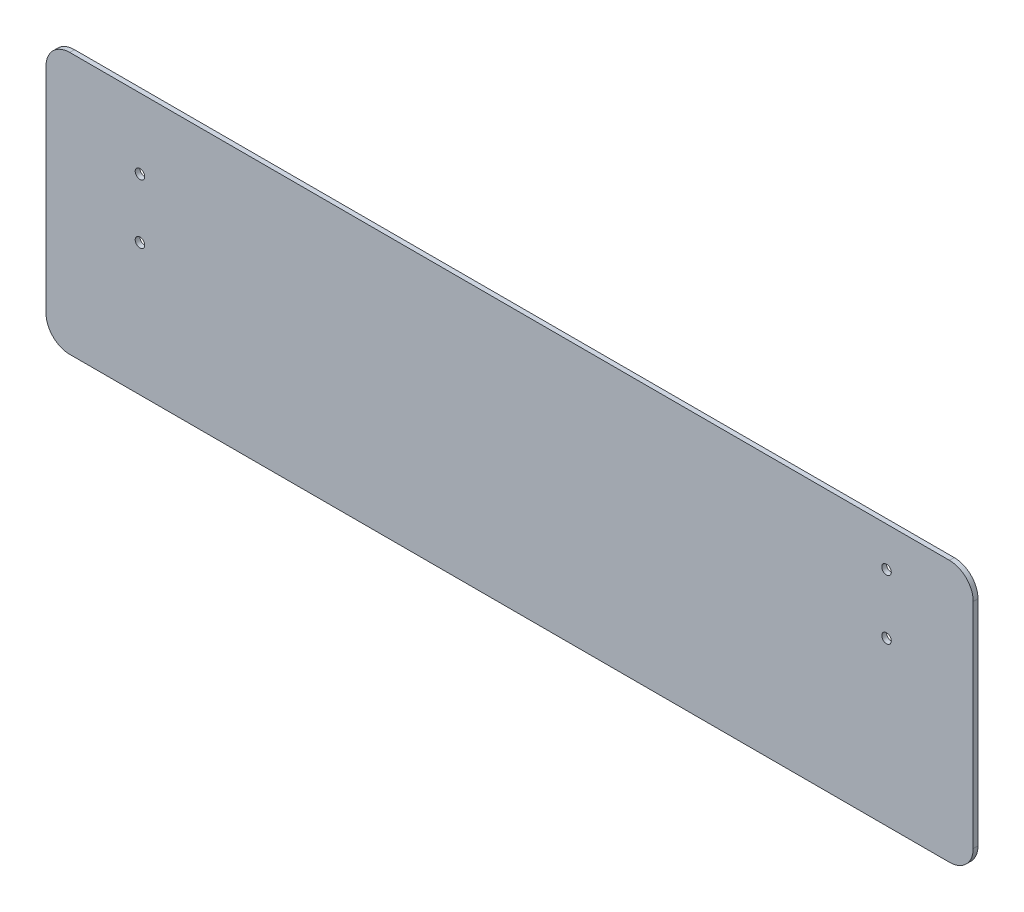
ISO-10303-21;
HEADER;
FILE_DESCRIPTION(('STEP AP214'),'2;1');
FILE_NAME('part.step','',(''),(''),'','','');
FILE_SCHEMA(('AUTOMOTIVE_DESIGN { 1 0 10303 214 1 1 1 1 }'));
ENDSEC;
DATA;
#1=APPLICATION_CONTEXT('core data for automotive mechanical design processes');
#2=APPLICATION_PROTOCOL_DEFINITION('international standard','automotive_design',2000,#1);
#3=PRODUCT_CONTEXT('',#1,'mechanical');
#4=PRODUCT('Part','Part','',(#3));
#5=PRODUCT_RELATED_PRODUCT_CATEGORY('part','',(#4));
#6=PRODUCT_DEFINITION_FORMATION('','',#4);
#7=PRODUCT_DEFINITION_CONTEXT('part definition',#1,'design');
#8=PRODUCT_DEFINITION('design','',#6,#7);
#9=PRODUCT_DEFINITION_SHAPE('','',#8);
#10=(LENGTH_UNIT() NAMED_UNIT(*) SI_UNIT(.MILLI.,.METRE.));
#11=(NAMED_UNIT(*) PLANE_ANGLE_UNIT() SI_UNIT($,.RADIAN.));
#12=(NAMED_UNIT(*) SI_UNIT($,.STERADIAN.) SOLID_ANGLE_UNIT());
#13=UNCERTAINTY_MEASURE_WITH_UNIT(LENGTH_MEASURE(1.E-05),#10,'distance_accuracy_value','');
#14=(GEOMETRIC_REPRESENTATION_CONTEXT(3) GLOBAL_UNCERTAINTY_ASSIGNED_CONTEXT((#13)) GLOBAL_UNIT_ASSIGNED_CONTEXT((#10,
#11,#12)) REPRESENTATION_CONTEXT('',''));
#15=CARTESIAN_POINT('',(0.,0.,0.));
#16=DIRECTION('',(0.,0.,1.));
#17=DIRECTION('',(1.,0.,0.));
#18=AXIS2_PLACEMENT_3D('',#15,#16,#17);
#19=CARTESIAN_POINT('',(185.,-45.,2.));
#20=DIRECTION('',(0.,0.,-1.));
#21=DIRECTION('',(-1.,0.,0.));
#22=AXIS2_PLACEMENT_3D('',#19,#20,#21);
#23=CYLINDRICAL_SURFACE('',#22,10.);
#24=CARTESIAN_POINT('',(185.,-45.,0.));
#25=DIRECTION('',(0.,0.,1.));
#26=DIRECTION('',(1.,0.,0.));
#27=AXIS2_PLACEMENT_3D('',#24,#25,#26);
#28=CIRCLE('',#27,10.);
#29=CARTESIAN_POINT('',(185.,-55.,0.));
#30=VERTEX_POINT('',#29);
#31=CARTESIAN_POINT('',(195.,-45.,0.));
#32=VERTEX_POINT('',#31);
#33=EDGE_CURVE('E146',#30,#32,#28,.T.);
#34=ORIENTED_EDGE('',*,*,#33,.T.);
#35=DIRECTION('',(0.,0.,-1.));
#36=VECTOR('',#35,1.);
#37=CARTESIAN_POINT('',(195.,-45.,2.));
#38=LINE('',#37,#36);
#39=CARTESIAN_POINT('',(195.,-45.,2.));
#40=VERTEX_POINT('',#39);
#41=EDGE_CURVE('E11',#40,#32,#38,.T.);
#42=ORIENTED_EDGE('',*,*,#41,.F.);
#43=CARTESIAN_POINT('',(185.,-45.,2.));
#44=DIRECTION('',(0.,0.,1.));
#45=DIRECTION('',(1.,0.,0.));
#46=AXIS2_PLACEMENT_3D('',#43,#44,#45);
#47=CIRCLE('',#46,10.);
#48=CARTESIAN_POINT('',(185.,-55.,2.));
#49=VERTEX_POINT('',#48);
#50=EDGE_CURVE('E168',#49,#40,#47,.T.);
#51=ORIENTED_EDGE('',*,*,#50,.F.);
#52=DIRECTION('',(0.,0.,-1.));
#53=VECTOR('',#52,1.);
#54=CARTESIAN_POINT('',(185.,-55.,2.));
#55=LINE('',#54,#53);
#56=EDGE_CURVE('E142',#49,#30,#55,.T.);
#57=ORIENTED_EDGE('',*,*,#56,.T.);
#58=EDGE_LOOP('',(#34,#42,#51,#57));
#59=FACE_BOUND('',#58,.T.);
#60=ADVANCED_FACE('F43',(#59),#23,.T.);
#61=CARTESIAN_POINT('',(195.,45.,2.));
#62=DIRECTION('',(-1.,0.,0.));
#63=DIRECTION('',(0.,-1.,0.));
#64=AXIS2_PLACEMENT_3D('',#61,#62,#63);
#65=PLANE('',#64);
#66=DIRECTION('',(0.,1.,0.));
#67=VECTOR('',#66,1.);
#68=CARTESIAN_POINT('',(195.,45.,0.));
#69=LINE('',#68,#67);
#70=CARTESIAN_POINT('',(195.,45.,0.));
#71=VERTEX_POINT('',#70);
#72=EDGE_CURVE('E150',#32,#71,#69,.T.);
#73=ORIENTED_EDGE('',*,*,#72,.T.);
#74=DIRECTION('',(0.,0.,-1.));
#75=VECTOR('',#74,1.);
#76=CARTESIAN_POINT('',(195.,45.,2.));
#77=LINE('',#76,#75);
#78=CARTESIAN_POINT('',(195.,45.,2.));
#79=VERTEX_POINT('',#78);
#80=EDGE_CURVE('E53',#79,#71,#77,.T.);
#81=ORIENTED_EDGE('',*,*,#80,.F.);
#82=DIRECTION('',(0.,1.,0.));
#83=VECTOR('',#82,1.);
#84=CARTESIAN_POINT('',(195.,45.,2.));
#85=LINE('',#84,#83);
#86=EDGE_CURVE('E105',#40,#79,#85,.T.);
#87=ORIENTED_EDGE('',*,*,#86,.F.);
#88=ORIENTED_EDGE('',*,*,#41,.T.);
#89=EDGE_LOOP('',(#73,#81,#87,#88));
#90=FACE_BOUND('',#89,.T.);
#91=ADVANCED_FACE('F218',(#90),#65,.F.);
#92=CARTESIAN_POINT('',(185.,45.,2.));
#93=DIRECTION('',(0.,0.,-1.));
#94=DIRECTION('',(-1.,0.,0.));
#95=AXIS2_PLACEMENT_3D('',#92,#93,#94);
#96=CYLINDRICAL_SURFACE('',#95,9.99999999999999);
#97=CARTESIAN_POINT('',(185.,45.,0.));
#98=DIRECTION('',(0.,0.,1.));
#99=DIRECTION('',(-1.,0.,0.));
#100=AXIS2_PLACEMENT_3D('',#97,#98,#99);
#101=CIRCLE('',#100,9.99999999999999);
#102=CARTESIAN_POINT('',(185.,55.,0.));
#103=VERTEX_POINT('',#102);
#104=EDGE_CURVE('E153',#71,#103,#101,.T.);
#105=ORIENTED_EDGE('',*,*,#104,.T.);
#106=DIRECTION('',(0.,0.,-1.));
#107=VECTOR('',#106,1.);
#108=CARTESIAN_POINT('',(185.,55.,2.));
#109=LINE('',#108,#107);
#110=CARTESIAN_POINT('',(185.,55.,2.));
#111=VERTEX_POINT('',#110);
#112=EDGE_CURVE('E179',#111,#103,#109,.T.);
#113=ORIENTED_EDGE('',*,*,#112,.F.);
#114=CARTESIAN_POINT('',(185.,45.,2.));
#115=DIRECTION('',(0.,0.,1.));
#116=DIRECTION('',(-1.,0.,0.));
#117=AXIS2_PLACEMENT_3D('',#114,#115,#116);
#118=CIRCLE('',#117,9.99999999999999);
#119=EDGE_CURVE('E233',#79,#111,#118,.T.);
#120=ORIENTED_EDGE('',*,*,#119,.F.);
#121=ORIENTED_EDGE('',*,*,#80,.T.);
#122=EDGE_LOOP('',(#105,#113,#120,#121));
#123=FACE_BOUND('',#122,.T.);
#124=ADVANCED_FACE('F223',(#123),#96,.T.);
#125=CARTESIAN_POINT('',(-185.,55.,2.));
#126=DIRECTION('',(0.,-1.,0.));
#127=DIRECTION('',(1.,0.,0.));
#128=AXIS2_PLACEMENT_3D('',#125,#126,#127);
#129=PLANE('',#128);
#130=DIRECTION('',(-1.,0.,0.));
#131=VECTOR('',#130,1.);
#132=CARTESIAN_POINT('',(-185.,55.,0.));
#133=LINE('',#132,#131);
#134=CARTESIAN_POINT('',(-185.,55.,0.));
#135=VERTEX_POINT('',#134);
#136=EDGE_CURVE('E156',#103,#135,#133,.T.);
#137=ORIENTED_EDGE('',*,*,#136,.T.);
#138=DIRECTION('',(0.,0.,-1.));
#139=VECTOR('',#138,1.);
#140=CARTESIAN_POINT('',(-185.,55.,2.));
#141=LINE('',#140,#139);
#142=CARTESIAN_POINT('',(-185.,55.,2.));
#143=VERTEX_POINT('',#142);
#144=EDGE_CURVE('E175',#143,#135,#141,.T.);
#145=ORIENTED_EDGE('',*,*,#144,.F.);
#146=DIRECTION('',(-1.,0.,0.));
#147=VECTOR('',#146,1.);
#148=CARTESIAN_POINT('',(-185.,55.,2.));
#149=LINE('',#148,#147);
#150=EDGE_CURVE('E236',#111,#143,#149,.T.);
#151=ORIENTED_EDGE('',*,*,#150,.F.);
#152=ORIENTED_EDGE('',*,*,#112,.T.);
#153=EDGE_LOOP('',(#137,#145,#151,#152));
#154=FACE_BOUND('',#153,.T.);
#155=ADVANCED_FACE('F292',(#154),#129,.F.);
#156=CARTESIAN_POINT('',(-185.,45.,2.));
#157=DIRECTION('',(0.,0.,-1.));
#158=DIRECTION('',(-1.,0.,0.));
#159=AXIS2_PLACEMENT_3D('',#156,#157,#158);
#160=CYLINDRICAL_SURFACE('',#159,9.99999999999999);
#161=CARTESIAN_POINT('',(-185.,45.,0.));
#162=DIRECTION('',(0.,0.,1.));
#163=DIRECTION('',(1.,0.,0.));
#164=AXIS2_PLACEMENT_3D('',#161,#162,#163);
#165=CIRCLE('',#164,9.99999999999999);
#166=CARTESIAN_POINT('',(-195.,45.,0.));
#167=VERTEX_POINT('',#166);
#168=EDGE_CURVE('E159',#135,#167,#165,.T.);
#169=ORIENTED_EDGE('',*,*,#168,.T.);
#170=DIRECTION('',(0.,0.,-1.));
#171=VECTOR('',#170,1.);
#172=CARTESIAN_POINT('',(-195.,45.,2.));
#173=LINE('',#172,#171);
#174=CARTESIAN_POINT('',(-195.,45.,2.));
#175=VERTEX_POINT('',#174);
#176=EDGE_CURVE('E135',#175,#167,#173,.T.);
#177=ORIENTED_EDGE('',*,*,#176,.F.);
#178=CARTESIAN_POINT('',(-185.,45.,2.));
#179=DIRECTION('',(0.,0.,1.));
#180=DIRECTION('',(1.,0.,0.));
#181=AXIS2_PLACEMENT_3D('',#178,#179,#180);
#182=CIRCLE('',#181,9.99999999999999);
#183=EDGE_CURVE('E124',#143,#175,#182,.T.);
#184=ORIENTED_EDGE('',*,*,#183,.F.);
#185=ORIENTED_EDGE('',*,*,#144,.T.);
#186=EDGE_LOOP('',(#169,#177,#184,#185));
#187=FACE_BOUND('',#186,.T.);
#188=ADVANCED_FACE('F289',(#187),#160,.T.);
#189=CARTESIAN_POINT('',(-195.,45.,2.));
#190=DIRECTION('',(1.,0.,0.));
#191=DIRECTION('',(0.,0.,-1.));
#192=AXIS2_PLACEMENT_3D('',#189,#190,#191);
#193=PLANE('',#192);
#194=DIRECTION('',(0.,-1.,0.));
#195=VECTOR('',#194,1.);
#196=CARTESIAN_POINT('',(-195.,45.,0.));
#197=LINE('',#196,#195);
#198=CARTESIAN_POINT('',(-195.,-45.,0.));
#199=VERTEX_POINT('',#198);
#200=EDGE_CURVE('E133',#167,#199,#197,.T.);
#201=ORIENTED_EDGE('',*,*,#200,.T.);
#202=DIRECTION('',(0.,0.,-1.));
#203=VECTOR('',#202,1.);
#204=CARTESIAN_POINT('',(-195.,-45.,2.));
#205=LINE('',#204,#203);
#206=CARTESIAN_POINT('',(-195.,-45.,2.));
#207=VERTEX_POINT('',#206);
#208=EDGE_CURVE('E130',#207,#199,#205,.T.);
#209=ORIENTED_EDGE('',*,*,#208,.F.);
#210=DIRECTION('',(0.,-1.,0.));
#211=VECTOR('',#210,1.);
#212=CARTESIAN_POINT('',(-195.,45.,2.));
#213=LINE('',#212,#211);
#214=EDGE_CURVE('E118',#175,#207,#213,.T.);
#215=ORIENTED_EDGE('',*,*,#214,.F.);
#216=ORIENTED_EDGE('',*,*,#176,.T.);
#217=EDGE_LOOP('',(#201,#209,#215,#216));
#218=FACE_BOUND('',#217,.T.);
#219=ADVANCED_FACE('F131',(#218),#193,.F.);
#220=CARTESIAN_POINT('',(-185.,-45.,2.));
#221=DIRECTION('',(0.,0.,-1.));
#222=DIRECTION('',(-1.,0.,0.));
#223=AXIS2_PLACEMENT_3D('',#220,#221,#222);
#224=CYLINDRICAL_SURFACE('',#223,9.99999999999999);
#225=CARTESIAN_POINT('',(-185.,-45.,0.));
#226=DIRECTION('',(0.,0.,1.));
#227=DIRECTION('',(1.,0.,0.));
#228=AXIS2_PLACEMENT_3D('',#225,#226,#227);
#229=CIRCLE('',#228,9.99999999999999);
#230=CARTESIAN_POINT('',(-185.,-55.,0.));
#231=VERTEX_POINT('',#230);
#232=EDGE_CURVE('E91',#199,#231,#229,.T.);
#233=ORIENTED_EDGE('',*,*,#232,.T.);
#234=DIRECTION('',(0.,0.,-1.));
#235=VECTOR('',#234,1.);
#236=CARTESIAN_POINT('',(-185.,-55.,2.));
#237=LINE('',#236,#235);
#238=CARTESIAN_POINT('',(-185.,-55.,2.));
#239=VERTEX_POINT('',#238);
#240=EDGE_CURVE('E136',#239,#231,#237,.T.);
#241=ORIENTED_EDGE('',*,*,#240,.F.);
#242=CARTESIAN_POINT('',(-185.,-45.,2.));
#243=DIRECTION('',(0.,0.,1.));
#244=DIRECTION('',(1.,0.,0.));
#245=AXIS2_PLACEMENT_3D('',#242,#243,#244);
#246=CIRCLE('',#245,9.99999999999999);
#247=EDGE_CURVE('E122',#207,#239,#246,.T.);
#248=ORIENTED_EDGE('',*,*,#247,.F.);
#249=ORIENTED_EDGE('',*,*,#208,.T.);
#250=EDGE_LOOP('',(#233,#241,#248,#249));
#251=FACE_BOUND('',#250,.T.);
#252=ADVANCED_FACE('F138',(#251),#224,.T.);
#253=CARTESIAN_POINT('',(-185.,-55.,2.));
#254=DIRECTION('',(0.,1.,0.));
#255=DIRECTION('',(-1.,0.,0.));
#256=AXIS2_PLACEMENT_3D('',#253,#254,#255);
#257=PLANE('',#256);
#258=DIRECTION('',(1.,0.,0.));
#259=VECTOR('',#258,1.);
#260=CARTESIAN_POINT('',(-185.,-55.,0.));
#261=LINE('',#260,#259);
#262=EDGE_CURVE('E97',#231,#30,#261,.T.);
#263=ORIENTED_EDGE('',*,*,#262,.T.);
#264=ORIENTED_EDGE('',*,*,#56,.F.);
#265=DIRECTION('',(1.,0.,0.));
#266=VECTOR('',#265,1.);
#267=CARTESIAN_POINT('',(-185.,-55.,2.));
#268=LINE('',#267,#266);
#269=EDGE_CURVE('E62',#239,#49,#268,.T.);
#270=ORIENTED_EDGE('',*,*,#269,.F.);
#271=ORIENTED_EDGE('',*,*,#240,.T.);
#272=EDGE_LOOP('',(#263,#264,#270,#271));
#273=FACE_BOUND('',#272,.T.);
#274=ADVANCED_FACE('F263',(#273),#257,.F.);
#275=CARTESIAN_POINT('',(185.,-45.,2.));
#276=DIRECTION('',(0.,0.,1.));
#277=DIRECTION('',(1.,0.,0.));
#278=AXIS2_PLACEMENT_3D('',#275,#276,#277);
#279=PLANE('',#278);
#280=CARTESIAN_POINT('',(-155.477396898591,0.510661873553803,2.));
#281=DIRECTION('',(0.,0.,1.));
#282=DIRECTION('',(1.,0.,0.));
#283=AXIS2_PLACEMENT_3D('',#280,#281,#282);
#284=CIRCLE('',#283,2.);
#285=CARTESIAN_POINT('',(-153.477396898591,0.510661873553803,2.));
#286=VERTEX_POINT('',#285);
#287=EDGE_CURVE('E191',#286,#286,#284,.T.);
#288=ORIENTED_EDGE('',*,*,#287,.F.);
#289=EDGE_LOOP('',(#288));
#290=FACE_BOUND('',#289,.T.);
#291=CARTESIAN_POINT('',(158.52260310141,13.3762956497315,2.));
#292=DIRECTION('',(0.,0.,1.));
#293=DIRECTION('',(1.,0.,0.));
#294=AXIS2_PLACEMENT_3D('',#291,#292,#293);
#295=CIRCLE('',#294,2.);
#296=CARTESIAN_POINT('',(160.52260310141,13.3762956497315,2.));
#297=VERTEX_POINT('',#296);
#298=EDGE_CURVE('E254',#297,#297,#295,.T.);
#299=ORIENTED_EDGE('',*,*,#298,.F.);
#300=EDGE_LOOP('',(#299));
#301=FACE_BOUND('',#300,.T.);
#302=CARTESIAN_POINT('',(158.52260310141,38.3762956497315,2.));
#303=DIRECTION('',(0.,0.,1.));
#304=DIRECTION('',(1.,0.,0.));
#305=AXIS2_PLACEMENT_3D('',#302,#303,#304);
#306=CIRCLE('',#305,2.);
#307=CARTESIAN_POINT('',(160.52260310141,38.3762956497315,2.));
#308=VERTEX_POINT('',#307);
#309=EDGE_CURVE('E250',#308,#308,#306,.T.);
#310=ORIENTED_EDGE('',*,*,#309,.F.);
#311=EDGE_LOOP('',(#310));
#312=FACE_BOUND('',#311,.T.);
#313=CARTESIAN_POINT('',(-155.477396898591,25.5106618735538,2.));
#314=DIRECTION('',(0.,0.,1.));
#315=DIRECTION('',(1.,0.,0.));
#316=AXIS2_PLACEMENT_3D('',#313,#314,#315);
#317=CIRCLE('',#316,2.);
#318=CARTESIAN_POINT('',(-153.477396898591,25.5106618735538,2.));
#319=VERTEX_POINT('',#318);
#320=EDGE_CURVE('E246',#319,#319,#317,.T.);
#321=ORIENTED_EDGE('',*,*,#320,.F.);
#322=EDGE_LOOP('',(#321));
#323=FACE_BOUND('',#322,.T.);
#324=ORIENTED_EDGE('',*,*,#50,.T.);
#325=ORIENTED_EDGE('',*,*,#86,.T.);
#326=ORIENTED_EDGE('',*,*,#119,.T.);
#327=ORIENTED_EDGE('',*,*,#150,.T.);
#328=ORIENTED_EDGE('',*,*,#183,.T.);
#329=ORIENTED_EDGE('',*,*,#214,.T.);
#330=ORIENTED_EDGE('',*,*,#247,.T.);
#331=ORIENTED_EDGE('',*,*,#269,.T.);
#332=EDGE_LOOP('',(#324,#325,#326,#327,#328,#329,#330,#331));
#333=FACE_BOUND('',#332,.T.);
#334=ADVANCED_FACE('F120',(#290,#301,#312,#323,#333),#279,.T.);
#335=CARTESIAN_POINT('',(185.,-45.,0.));
#336=DIRECTION('',(0.,0.,1.));
#337=DIRECTION('',(1.,0.,0.));
#338=AXIS2_PLACEMENT_3D('',#335,#336,#337);
#339=PLANE('',#338);
#340=CARTESIAN_POINT('',(-155.477396898591,0.510661873553803,0.));
#341=DIRECTION('',(0.,0.,1.));
#342=DIRECTION('',(1.,0.,0.));
#343=AXIS2_PLACEMENT_3D('',#340,#341,#342);
#344=CIRCLE('',#343,2.);
#345=CARTESIAN_POINT('',(-153.477396898591,0.510661873553803,0.));
#346=VERTEX_POINT('',#345);
#347=EDGE_CURVE('E46',#346,#346,#344,.T.);
#348=ORIENTED_EDGE('',*,*,#347,.T.);
#349=EDGE_LOOP('',(#348));
#350=FACE_BOUND('',#349,.T.);
#351=CARTESIAN_POINT('',(158.52260310141,13.3762956497315,0.));
#352=DIRECTION('',(0.,0.,1.));
#353=DIRECTION('',(1.,0.,0.));
#354=AXIS2_PLACEMENT_3D('',#351,#352,#353);
#355=CIRCLE('',#354,2.);
#356=CARTESIAN_POINT('',(160.52260310141,13.3762956497315,0.));
#357=VERTEX_POINT('',#356);
#358=EDGE_CURVE('E194',#357,#357,#355,.T.);
#359=ORIENTED_EDGE('',*,*,#358,.T.);
#360=EDGE_LOOP('',(#359));
#361=FACE_BOUND('',#360,.T.);
#362=CARTESIAN_POINT('',(158.52260310141,38.3762956497315,0.));
#363=DIRECTION('',(0.,0.,1.));
#364=DIRECTION('',(1.,0.,0.));
#365=AXIS2_PLACEMENT_3D('',#362,#363,#364);
#366=CIRCLE('',#365,2.);
#367=CARTESIAN_POINT('',(160.52260310141,38.3762956497315,0.));
#368=VERTEX_POINT('',#367);
#369=EDGE_CURVE('E190',#368,#368,#366,.T.);
#370=ORIENTED_EDGE('',*,*,#369,.T.);
#371=EDGE_LOOP('',(#370));
#372=FACE_BOUND('',#371,.T.);
#373=CARTESIAN_POINT('',(-155.477396898591,25.5106618735538,0.));
#374=DIRECTION('',(0.,0.,1.));
#375=DIRECTION('',(1.,0.,0.));
#376=AXIS2_PLACEMENT_3D('',#373,#374,#375);
#377=CIRCLE('',#376,2.);
#378=CARTESIAN_POINT('',(-153.477396898591,25.5106618735538,0.));
#379=VERTEX_POINT('',#378);
#380=EDGE_CURVE('E186',#379,#379,#377,.T.);
#381=ORIENTED_EDGE('',*,*,#380,.T.);
#382=EDGE_LOOP('',(#381));
#383=FACE_BOUND('',#382,.T.);
#384=ORIENTED_EDGE('',*,*,#33,.F.);
#385=ORIENTED_EDGE('',*,*,#262,.F.);
#386=ORIENTED_EDGE('',*,*,#232,.F.);
#387=ORIENTED_EDGE('',*,*,#200,.F.);
#388=ORIENTED_EDGE('',*,*,#168,.F.);
#389=ORIENTED_EDGE('',*,*,#136,.F.);
#390=ORIENTED_EDGE('',*,*,#104,.F.);
#391=ORIENTED_EDGE('',*,*,#72,.F.);
#392=EDGE_LOOP('',(#384,#385,#386,#387,#388,#389,#390,#391));
#393=FACE_BOUND('',#392,.T.);
#394=ADVANCED_FACE('F203',(#350,#361,#372,#383,#393),#339,.F.);
#395=CARTESIAN_POINT('',(-155.477396898591,25.5106618735538,-8.));
#396=DIRECTION('',(0.,0.,1.));
#397=DIRECTION('',(1.,0.,0.));
#398=AXIS2_PLACEMENT_3D('',#395,#396,#397);
#399=CYLINDRICAL_SURFACE('',#398,2.);
#400=ORIENTED_EDGE('',*,*,#320,.T.);
#401=EDGE_LOOP('',(#400));
#402=FACE_BOUND('',#401,.T.);
#403=ORIENTED_EDGE('',*,*,#380,.F.);
#404=EDGE_LOOP('',(#403));
#405=FACE_BOUND('',#404,.T.);
#406=ADVANCED_FACE('F271',(#402,#405),#399,.F.);
#407=CARTESIAN_POINT('',(158.52260310141,38.3762956497315,-8.));
#408=DIRECTION('',(0.,0.,1.));
#409=DIRECTION('',(1.,0.,0.));
#410=AXIS2_PLACEMENT_3D('',#407,#408,#409);
#411=CYLINDRICAL_SURFACE('',#410,2.);
#412=ORIENTED_EDGE('',*,*,#309,.T.);
#413=EDGE_LOOP('',(#412));
#414=FACE_BOUND('',#413,.T.);
#415=ORIENTED_EDGE('',*,*,#369,.F.);
#416=EDGE_LOOP('',(#415));
#417=FACE_BOUND('',#416,.T.);
#418=ADVANCED_FACE('F213',(#414,#417),#411,.F.);
#419=CARTESIAN_POINT('',(158.52260310141,13.3762956497315,-8.));
#420=DIRECTION('',(0.,0.,1.));
#421=DIRECTION('',(1.,0.,0.));
#422=AXIS2_PLACEMENT_3D('',#419,#420,#421);
#423=CYLINDRICAL_SURFACE('',#422,2.);
#424=ORIENTED_EDGE('',*,*,#298,.T.);
#425=EDGE_LOOP('',(#424));
#426=FACE_BOUND('',#425,.T.);
#427=ORIENTED_EDGE('',*,*,#358,.F.);
#428=EDGE_LOOP('',(#427));
#429=FACE_BOUND('',#428,.T.);
#430=ADVANCED_FACE('F207',(#426,#429),#423,.F.);
#431=CARTESIAN_POINT('',(-155.477396898591,0.510661873553803,-8.));
#432=DIRECTION('',(0.,0.,1.));
#433=DIRECTION('',(1.,0.,0.));
#434=AXIS2_PLACEMENT_3D('',#431,#432,#433);
#435=CYLINDRICAL_SURFACE('',#434,2.);
#436=ORIENTED_EDGE('',*,*,#287,.T.);
#437=EDGE_LOOP('',(#436));
#438=FACE_BOUND('',#437,.T.);
#439=ORIENTED_EDGE('',*,*,#347,.F.);
#440=EDGE_LOOP('',(#439));
#441=FACE_BOUND('',#440,.T.);
#442=ADVANCED_FACE('F205',(#438,#441),#435,.F.);
#443=CLOSED_SHELL('',(#60,#91,#124,#155,#188,#219,#252,#274,#334,#394,#406,#418,#430,#442));
#444=MANIFOLD_SOLID_BREP('B2',#443);
#445=ADVANCED_BREP_SHAPE_REPRESENTATION('',(#18,#444),#14);
#446=SHAPE_DEFINITION_REPRESENTATION(#9,#445);
ENDSEC;
END-ISO-10303-21;
